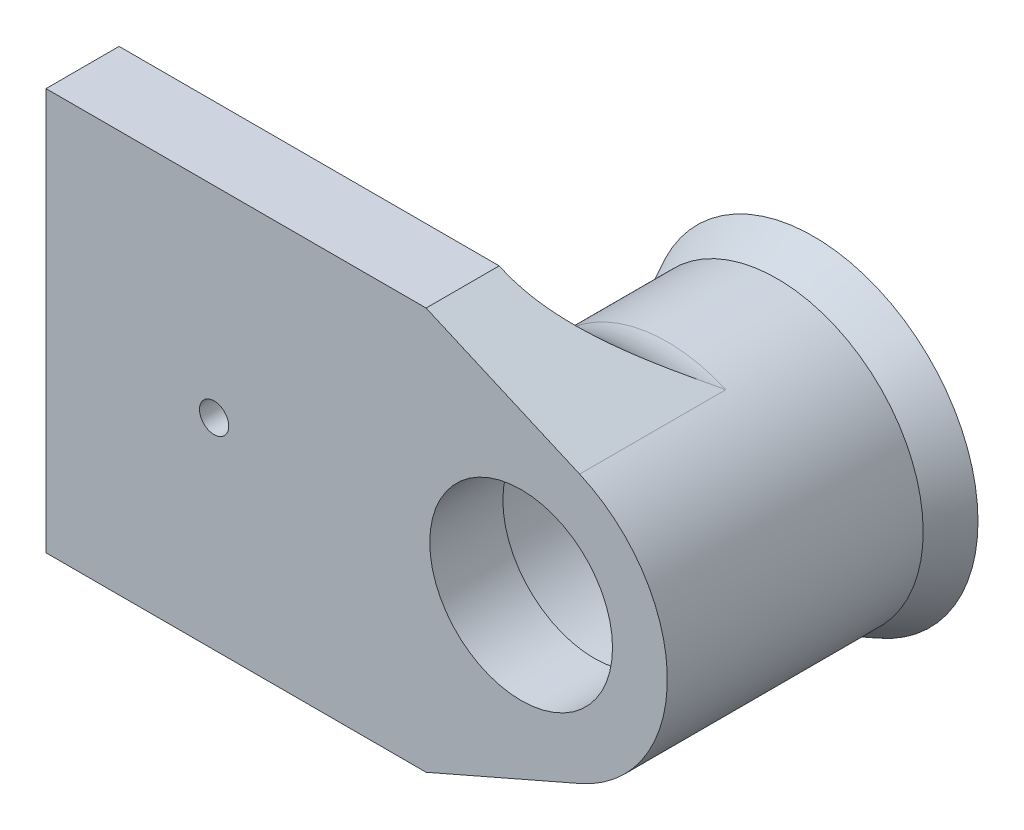
ISO-10303-21;
HEADER;
FILE_DESCRIPTION(('STEP AP214'),'2;1');
FILE_NAME('part.step','',(''),(''),'','','');
FILE_SCHEMA(('AUTOMOTIVE_DESIGN { 1 0 10303 214 1 1 1 1 }'));
ENDSEC;
DATA;
#1=APPLICATION_CONTEXT('core data for automotive mechanical design processes');
#2=APPLICATION_PROTOCOL_DEFINITION('international standard','automotive_design',2000,#1);
#3=PRODUCT_CONTEXT('',#1,'mechanical');
#4=PRODUCT('Part','Part','',(#3));
#5=PRODUCT_RELATED_PRODUCT_CATEGORY('part','',(#4));
#6=PRODUCT_DEFINITION_FORMATION('','',#4);
#7=PRODUCT_DEFINITION_CONTEXT('part definition',#1,'design');
#8=PRODUCT_DEFINITION('design','',#6,#7);
#9=PRODUCT_DEFINITION_SHAPE('','',#8);
#10=(LENGTH_UNIT() NAMED_UNIT(*) SI_UNIT(.MILLI.,.METRE.));
#11=(NAMED_UNIT(*) PLANE_ANGLE_UNIT() SI_UNIT($,.RADIAN.));
#12=(NAMED_UNIT(*) SI_UNIT($,.STERADIAN.) SOLID_ANGLE_UNIT());
#13=UNCERTAINTY_MEASURE_WITH_UNIT(LENGTH_MEASURE(1.E-05),#10,'distance_accuracy_value','');
#14=(GEOMETRIC_REPRESENTATION_CONTEXT(3) GLOBAL_UNCERTAINTY_ASSIGNED_CONTEXT((#13)) GLOBAL_UNIT_ASSIGNED_CONTEXT((#10,
#11,#12)) REPRESENTATION_CONTEXT('',''));
#15=CARTESIAN_POINT('',(0.,0.,0.));
#16=DIRECTION('',(0.,0.,1.));
#17=DIRECTION('',(1.,0.,0.));
#18=AXIS2_PLACEMENT_3D('',#15,#16,#17);
#19=CARTESIAN_POINT('',(0.,0.,0.));
#20=DIRECTION('',(0.,0.,1.));
#21=DIRECTION('',(1.,0.,0.));
#22=AXIS2_PLACEMENT_3D('',#19,#20,#21);
#23=PLANE('',#22);
#24=CARTESIAN_POINT('',(0.,0.,0.));
#25=DIRECTION('',(0.,0.,1.));
#26=DIRECTION('',(1.,0.,0.));
#27=AXIS2_PLACEMENT_3D('',#24,#25,#26);
#28=CIRCLE('',#27,12.5);
#29=CARTESIAN_POINT('',(12.5,0.,0.));
#30=VERTEX_POINT('',#29);
#31=EDGE_CURVE('E145',#30,#30,#28,.T.);
#32=ORIENTED_EDGE('',*,*,#31,.T.);
#33=EDGE_LOOP('',(#32));
#34=FACE_BOUND('',#33,.T.);
#35=CARTESIAN_POINT('',(0.,0.,0.));
#36=DIRECTION('',(0.,0.,-1.));
#37=DIRECTION('',(-1.,0.,0.));
#38=AXIS2_PLACEMENT_3D('',#35,#36,#37);
#39=CIRCLE('',#38,15.);
#40=CARTESIAN_POINT('',(-15.,0.,0.));
#41=VERTEX_POINT('',#40);
#42=EDGE_CURVE('E211',#41,#41,#39,.T.);
#43=ORIENTED_EDGE('',*,*,#42,.T.);
#44=EDGE_LOOP('',(#43));
#45=FACE_BOUND('',#44,.T.);
#46=ADVANCED_FACE('F34',(#34,#45),#23,.F.);
#47=CARTESIAN_POINT('',(0.,0.,10.));
#48=DIRECTION('',(0.,0.,1.));
#49=DIRECTION('',(1.,0.,0.));
#50=AXIS2_PLACEMENT_3D('',#47,#48,#49);
#51=PLANE('',#50);
#52=CARTESIAN_POINT('',(0.,0.,10.));
#53=DIRECTION('',(0.,0.,1.));
#54=DIRECTION('',(1.,0.,0.));
#55=AXIS2_PLACEMENT_3D('',#52,#53,#54);
#56=CIRCLE('',#55,12.5);
#57=CARTESIAN_POINT('',(12.5,0.,10.));
#58=VERTEX_POINT('',#57);
#59=EDGE_CURVE('E153',#58,#58,#56,.T.);
#60=ORIENTED_EDGE('',*,*,#59,.F.);
#61=EDGE_LOOP('',(#60));
#62=FACE_BOUND('',#61,.T.);
#63=DIRECTION('',(0.,-1.,0.));
#64=VECTOR('',#63,1.);
#65=CARTESIAN_POINT('',(-65.,27.5,10.));
#66=LINE('',#65,#64);
#67=CARTESIAN_POINT('',(-65.,27.5,10.));
#68=VERTEX_POINT('',#67);
#69=CARTESIAN_POINT('',(-65.,-27.5,10.));
#70=VERTEX_POINT('',#69);
#71=EDGE_CURVE('E132',#68,#70,#66,.T.);
#72=ORIENTED_EDGE('',*,*,#71,.T.);
#73=DIRECTION('',(1.,0.,0.));
#74=VECTOR('',#73,1.);
#75=CARTESIAN_POINT('',(-13.,-27.5,10.));
#76=LINE('',#75,#74);
#77=CARTESIAN_POINT('',(-13.,-27.5,10.));
#78=VERTEX_POINT('',#77);
#79=EDGE_CURVE('E101',#70,#78,#76,.T.);
#80=ORIENTED_EDGE('',*,*,#79,.T.);
#81=DIRECTION('',(0.916442402102688,0.400166619832609,0.));
#82=VECTOR('',#81,1.);
#83=CARTESIAN_POINT('',(-13.,-27.5,10.));
#84=LINE('',#83,#82);
#85=CARTESIAN_POINT('',(8.00333239665218,-18.3288480420538,10.));
#86=VERTEX_POINT('',#85);
#87=EDGE_CURVE('E136',#78,#86,#84,.T.);
#88=ORIENTED_EDGE('',*,*,#87,.T.);
#89=CARTESIAN_POINT('',(0.,0.,10.));
#90=DIRECTION('',(0.,0.,1.));
#91=DIRECTION('',(1.,0.,0.));
#92=AXIS2_PLACEMENT_3D('',#89,#90,#91);
#93=CIRCLE('',#92,20.);
#94=CARTESIAN_POINT('',(8.00333239665218,18.3288480420538,10.));
#95=VERTEX_POINT('',#94);
#96=EDGE_CURVE('E139',#86,#95,#93,.T.);
#97=ORIENTED_EDGE('',*,*,#96,.T.);
#98=DIRECTION('',(-0.916442402102688,0.400166619832609,0.));
#99=VECTOR('',#98,1.);
#100=CARTESIAN_POINT('',(-13.,27.5,10.));
#101=LINE('',#100,#99);
#102=CARTESIAN_POINT('',(-13.,27.5,10.));
#103=VERTEX_POINT('',#102);
#104=EDGE_CURVE('E122',#95,#103,#101,.T.);
#105=ORIENTED_EDGE('',*,*,#104,.T.);
#106=DIRECTION('',(-1.,0.,0.));
#107=VECTOR('',#106,1.);
#108=CARTESIAN_POINT('',(-13.,27.5,10.));
#109=LINE('',#108,#107);
#110=EDGE_CURVE('E119',#103,#68,#109,.T.);
#111=ORIENTED_EDGE('',*,*,#110,.T.);
#112=EDGE_LOOP('',(#72,#80,#88,#97,#105,#111));
#113=FACE_BOUND('',#112,.T.);
#114=CARTESIAN_POINT('',(-42.,0.,10.));
#115=DIRECTION('',(0.,0.,1.));
#116=DIRECTION('',(1.,0.,0.));
#117=AXIS2_PLACEMENT_3D('',#114,#115,#116);
#118=CIRCLE('',#117,2.);
#119=CARTESIAN_POINT('',(-40.,0.,10.));
#120=VERTEX_POINT('',#119);
#121=EDGE_CURVE('E125',#120,#120,#118,.T.);
#122=ORIENTED_EDGE('',*,*,#121,.F.);
#123=EDGE_LOOP('',(#122));
#124=FACE_BOUND('',#123,.T.);
#125=ADVANCED_FACE('F197',(#62,#113,#124),#51,.T.);
#126=DIRECTION('',(-0.916442402102688,0.400166619832609,0.));
#127=VECTOR('',#126,1.);
#128=CARTESIAN_POINT('',(-13.,27.5,0.));
#129=LINE('',#128,#127);
#130=CARTESIAN_POINT('',(-12.4889426889959,27.276845684774,0.));
#131=VERTEX_POINT('',#130);
#132=CARTESIAN_POINT('',(-13.,27.5,0.));
#133=VERTEX_POINT('',#132);
#134=EDGE_CURVE('E129',#131,#133,#129,.T.);
#135=ORIENTED_EDGE('',*,*,#134,.F.);
#136=CARTESIAN_POINT('',(0.,0.,0.));
#137=DIRECTION('',(0.,0.,1.));
#138=DIRECTION('',(1.,0.,0.));
#139=AXIS2_PLACEMENT_3D('',#136,#137,#138);
#140=CIRCLE('',#139,30.);
#141=CARTESIAN_POINT('',(-12.4889426889959,-27.276845684774,0.));
#142=VERTEX_POINT('',#141);
#143=EDGE_CURVE('E58',#131,#142,#140,.T.);
#144=ORIENTED_EDGE('',*,*,#143,.T.);
#145=DIRECTION('',(0.916442402102688,0.400166619832609,0.));
#146=VECTOR('',#145,1.);
#147=CARTESIAN_POINT('',(-13.,-27.5,0.));
#148=LINE('',#147,#146);
#149=CARTESIAN_POINT('',(-13.,-27.5,0.));
#150=VERTEX_POINT('',#149);
#151=EDGE_CURVE('E115',#150,#142,#148,.T.);
#152=ORIENTED_EDGE('',*,*,#151,.F.);
#153=DIRECTION('',(1.,0.,0.));
#154=VECTOR('',#153,1.);
#155=CARTESIAN_POINT('',(-13.,-27.5,0.));
#156=LINE('',#155,#154);
#157=CARTESIAN_POINT('',(-65.,-27.5,0.));
#158=VERTEX_POINT('',#157);
#159=EDGE_CURVE('E99',#158,#150,#156,.T.);
#160=ORIENTED_EDGE('',*,*,#159,.F.);
#161=DIRECTION('',(0.,-1.,0.));
#162=VECTOR('',#161,1.);
#163=CARTESIAN_POINT('',(-65.,27.5,0.));
#164=LINE('',#163,#162);
#165=CARTESIAN_POINT('',(-65.,27.5,0.));
#166=VERTEX_POINT('',#165);
#167=EDGE_CURVE('E113',#166,#158,#164,.T.);
#168=ORIENTED_EDGE('',*,*,#167,.F.);
#169=DIRECTION('',(-1.,0.,0.));
#170=VECTOR('',#169,1.);
#171=CARTESIAN_POINT('',(-13.,27.5,0.));
#172=LINE('',#171,#170);
#173=EDGE_CURVE('E107',#133,#166,#172,.T.);
#174=ORIENTED_EDGE('',*,*,#173,.F.);
#175=EDGE_LOOP('',(#135,#144,#152,#160,#168,#174));
#176=FACE_BOUND('',#175,.T.);
#177=CARTESIAN_POINT('',(-42.,0.,0.));
#178=DIRECTION('',(0.,0.,1.));
#179=DIRECTION('',(1.,0.,0.));
#180=AXIS2_PLACEMENT_3D('',#177,#178,#179);
#181=CIRCLE('',#180,2.);
#182=CARTESIAN_POINT('',(-40.,0.,0.));
#183=VERTEX_POINT('',#182);
#184=EDGE_CURVE('E134',#183,#183,#181,.T.);
#185=ORIENTED_EDGE('',*,*,#184,.T.);
#186=EDGE_LOOP('',(#185));
#187=FACE_BOUND('',#186,.T.);
#188=ADVANCED_FACE('F110',(#176,#187),#23,.F.);
#189=CARTESIAN_POINT('',(0.,0.,10.));
#190=DIRECTION('',(0.,0.,-1.));
#191=DIRECTION('',(-1.,0.,0.));
#192=AXIS2_PLACEMENT_3D('',#189,#190,#191);
#193=CYLINDRICAL_SURFACE('',#192,12.5);
#194=ORIENTED_EDGE('',*,*,#59,.T.);
#195=EDGE_LOOP('',(#194));
#196=FACE_BOUND('',#195,.T.);
#197=ORIENTED_EDGE('',*,*,#31,.F.);
#198=EDGE_LOOP('',(#197));
#199=FACE_BOUND('',#198,.T.);
#200=ADVANCED_FACE('F193',(#196,#199),#193,.F.);
#201=CARTESIAN_POINT('',(-65.,27.5,0.));
#202=DIRECTION('',(-1.,0.,0.));
#203=DIRECTION('',(0.,-1.,0.));
#204=AXIS2_PLACEMENT_3D('',#201,#202,#203);
#205=PLANE('',#204);
#206=ORIENTED_EDGE('',*,*,#71,.F.);
#207=DIRECTION('',(0.,0.,1.));
#208=VECTOR('',#207,1.);
#209=CARTESIAN_POINT('',(-65.,27.5,0.));
#210=LINE('',#209,#208);
#211=EDGE_CURVE('E118',#166,#68,#210,.T.);
#212=ORIENTED_EDGE('',*,*,#211,.F.);
#213=ORIENTED_EDGE('',*,*,#167,.T.);
#214=DIRECTION('',(0.,0.,1.));
#215=VECTOR('',#214,1.);
#216=CARTESIAN_POINT('',(-65.,-27.5,0.));
#217=LINE('',#216,#215);
#218=EDGE_CURVE('E96',#158,#70,#217,.T.);
#219=ORIENTED_EDGE('',*,*,#218,.T.);
#220=EDGE_LOOP('',(#206,#212,#213,#219));
#221=FACE_BOUND('',#220,.T.);
#222=ADVANCED_FACE('F117',(#221),#205,.T.);
#223=CARTESIAN_POINT('',(-13.,27.5,0.));
#224=DIRECTION('',(0.,1.,0.));
#225=DIRECTION('',(-1.,0.,0.));
#226=AXIS2_PLACEMENT_3D('',#223,#224,#225);
#227=PLANE('',#226);
#228=ORIENTED_EDGE('',*,*,#110,.F.);
#229=DIRECTION('',(0.,0.,1.));
#230=VECTOR('',#229,1.);
#231=CARTESIAN_POINT('',(-13.,27.5,0.));
#232=LINE('',#231,#230);
#233=EDGE_CURVE('E146',#133,#103,#232,.T.);
#234=ORIENTED_EDGE('',*,*,#233,.F.);
#235=ORIENTED_EDGE('',*,*,#173,.T.);
#236=ORIENTED_EDGE('',*,*,#211,.T.);
#237=EDGE_LOOP('',(#228,#234,#235,#236));
#238=FACE_BOUND('',#237,.T.);
#239=ADVANCED_FACE('F179',(#238),#227,.T.);
#240=CARTESIAN_POINT('',(-13.,27.5,0.));
#241=DIRECTION('',(0.400166619832609,0.916442402102688,0.));
#242=DIRECTION('',(-0.916442402102688,0.400166619832609,0.));
#243=AXIS2_PLACEMENT_3D('',#240,#241,#242);
#244=PLANE('',#243);
#245=ORIENTED_EDGE('',*,*,#104,.F.);
#246=DIRECTION('',(0.,0.,1.));
#247=VECTOR('',#246,1.);
#248=CARTESIAN_POINT('',(8.00333239665218,18.3288480420538,0.));
#249=LINE('',#248,#247);
#250=CARTESIAN_POINT('',(8.00333239665218,18.3288480420538,-10.));
#251=VERTEX_POINT('',#250);
#252=EDGE_CURVE('E148',#251,#95,#249,.T.);
#253=ORIENTED_EDGE('',*,*,#252,.F.);
#254=CARTESIAN_POINT('',(-12.4889426889959,27.276845684774,0.));
#255=CARTESIAN_POINT('',(-11.9446877341966,27.0391955443075,-3.26330413884413E-05));
#256=CARTESIAN_POINT('',(-11.4009658007099,26.8017781487865,-0.0293719903271018));
#257=CARTESIAN_POINT('',(-10.3190514183103,26.3293578195222,-0.140443207630718));
#258=CARTESIAN_POINT('',(-9.78085010249353,26.0943510140255,-0.222070433942941));
#259=CARTESIAN_POINT('',(-8.72103298293498,25.6315795038887,-0.429822205031779));
#260=CARTESIAN_POINT('',(-8.19928998965758,25.403759261654,-0.555192532645066));
#261=CARTESIAN_POINT('',(-7.16490702594321,24.9520936324205,-0.845283013004483));
#262=CARTESIAN_POINT('',(-6.65227232148572,24.7282505448233,-1.01002518122993));
#263=CARTESIAN_POINT('',(-5.0340801193754,24.0216633089291,-1.58998860297864));
#264=CARTESIAN_POINT('',(-3.94783443576172,23.5473517073248,-2.0702259975438));
#265=CARTESIAN_POINT('',(-2.35695409733697,22.8526902576527,-2.87830371516685));
#266=CARTESIAN_POINT('',(-1.83262705278875,22.6237416836646,-3.16257464352071));
#267=CARTESIAN_POINT('',(-0.795669896103483,22.1709520273262,-3.75554576306418));
#268=CARTESIAN_POINT('',(-0.283038683363703,21.9471104643954,-4.0642436433082));
#269=CARTESIAN_POINT('',(1.24812842479014,21.2785229299655,-5.0256061049934));
#270=CARTESIAN_POINT('',(2.25056544846398,20.840806566735,-5.70859299262033));
#271=CARTESIAN_POINT('',(4.22621060103694,19.9781367023989,-7.12093445123687));
#272=CARTESIAN_POINT('',(5.19943169360704,19.5531775406775,-7.85026799580421));
#273=CARTESIAN_POINT('',(6.77352196187045,18.8658475126067,-9.05116936694297));
#274=CARTESIAN_POINT('',(7.37785717246115,18.6019631943854,-9.51739782600086));
#275=CARTESIAN_POINT('',(7.98922284263654,18.3350090102988,-9.98911337839222));
#276=CARTESIAN_POINT('',(7.99627761953532,18.3319285262239,-9.99455668892817));
#277=CARTESIAN_POINT('',(8.00333239665217,18.3288480420538,-10.));
#278=B_SPLINE_CURVE_WITH_KNOTS('',3,(#254,#255,#256,#257,#258,#259,#260,#261,#262,#263,#264,
#265,#266,#267,#268,#269,#270,#271,#272,#273,#274,#275,#276,#277),.UNSPECIFIED.,.F.,.F.,(4,2,2,
2,2,2,2,2,2,2,2,4),(0.,1.78007201554378,3.55659299449943,5.30388464058352,7.0521556119378,
10.8779322078759,12.7942256891163,14.710338093017,18.5765462026303,22.4410126539083,
24.8638369819083,24.8921212531558),.UNSPECIFIED.);
#279=EDGE_CURVE('E44',#251,#131,#278,.F.);
#280=ORIENTED_EDGE('',*,*,#279,.T.);
#281=ORIENTED_EDGE('',*,*,#134,.T.);
#282=ORIENTED_EDGE('',*,*,#233,.T.);
#283=EDGE_LOOP('',(#245,#253,#280,#281,#282));
#284=FACE_BOUND('',#283,.T.);
#285=ADVANCED_FACE('F173',(#284),#244,.T.);
#286=CARTESIAN_POINT('',(0.,0.,0.));
#287=DIRECTION('',(0.,0.,1.));
#288=DIRECTION('',(1.,0.,0.));
#289=AXIS2_PLACEMENT_3D('',#286,#287,#288);
#290=CYLINDRICAL_SURFACE('',#289,20.);
#291=CARTESIAN_POINT('',(0.,0.,-10.));
#292=DIRECTION('',(0.,0.,1.));
#293=DIRECTION('',(1.,0.,0.));
#294=AXIS2_PLACEMENT_3D('',#291,#292,#293);
#295=CIRCLE('',#294,20.);
#296=CARTESIAN_POINT('',(8.00333239665218,-18.3288480420538,-10.));
#297=VERTEX_POINT('',#296);
#298=EDGE_CURVE('E156',#297,#251,#295,.F.);
#299=ORIENTED_EDGE('',*,*,#298,.T.);
#300=ORIENTED_EDGE('',*,*,#252,.T.);
#301=ORIENTED_EDGE('',*,*,#96,.F.);
#302=DIRECTION('',(0.,0.,1.));
#303=VECTOR('',#302,1.);
#304=CARTESIAN_POINT('',(8.00333239665218,-18.3288480420538,0.));
#305=LINE('',#304,#303);
#306=EDGE_CURVE('E150',#297,#86,#305,.T.);
#307=ORIENTED_EDGE('',*,*,#306,.F.);
#308=EDGE_LOOP('',(#299,#300,#301,#307));
#309=FACE_BOUND('',#308,.T.);
#310=CARTESIAN_POINT('',(0.,0.,-25.));
#311=DIRECTION('',(0.,0.,-1.));
#312=DIRECTION('',(-1.,0.,0.));
#313=AXIS2_PLACEMENT_3D('',#310,#311,#312);
#314=CIRCLE('',#313,20.);
#315=CARTESIAN_POINT('',(-20.,0.,-25.));
#316=VERTEX_POINT('',#315);
#317=EDGE_CURVE('E213',#316,#316,#314,.T.);
#318=ORIENTED_EDGE('',*,*,#317,.F.);
#319=EDGE_LOOP('',(#318));
#320=FACE_BOUND('',#319,.T.);
#321=ADVANCED_FACE('F178',(#309,#320),#290,.T.);
#322=CARTESIAN_POINT('',(-13.,-27.5,0.));
#323=DIRECTION('',(0.400166619832609,-0.916442402102688,0.));
#324=DIRECTION('',(0.916442402102688,0.400166619832609,0.));
#325=AXIS2_PLACEMENT_3D('',#322,#323,#324);
#326=PLANE('',#325);
#327=ORIENTED_EDGE('',*,*,#87,.F.);
#328=DIRECTION('',(0.,0.,1.));
#329=VECTOR('',#328,1.);
#330=CARTESIAN_POINT('',(-13.,-27.5,0.));
#331=LINE('',#330,#329);
#332=EDGE_CURVE('E106',#150,#78,#331,.T.);
#333=ORIENTED_EDGE('',*,*,#332,.F.);
#334=ORIENTED_EDGE('',*,*,#151,.T.);
#335=CARTESIAN_POINT('',(-12.4889426889959,-27.276845684774,0.));
#336=CARTESIAN_POINT('',(-11.9446877341945,-27.0391955443066,-3.26330413886618E-05));
#337=CARTESIAN_POINT('',(-11.4009658007058,-26.8017781487847,-0.0293719903273203));
#338=CARTESIAN_POINT('',(-10.3190514183027,-26.3293578195189,-0.140443207631702));
#339=CARTESIAN_POINT('',(-9.78085010248425,-26.0943510140215,-0.222070433944435));
#340=CARTESIAN_POINT('',(-8.72103298292612,-25.6315795038848,-0.429822205033833));
#341=CARTESIAN_POINT('',(-8.19928998965068,-25.403759261651,-0.555192532646868));
#342=CARTESIAN_POINT('',(-7.16490702593992,-24.9520936324191,-0.845283013005533));
#343=CARTESIAN_POINT('',(-6.65227232148408,-24.7282505448226,-1.0100251812305));
#344=CARTESIAN_POINT('',(-5.03408011937625,-24.0216633089295,-1.58998860297837));
#345=CARTESIAN_POINT('',(-3.94783443576346,-23.5473517073255,-2.07022599754321));
#346=CARTESIAN_POINT('',(-2.35695409734033,-22.8526902576542,-2.87830371516499));
#347=CARTESIAN_POINT('',(-1.83262705279298,-22.6237416836664,-3.1625746435181));
#348=CARTESIAN_POINT('',(-0.795669896109767,-22.170952027329,-3.75554576306076));
#349=CARTESIAN_POINT('',(-0.283038683371172,-21.9471104643986,-4.06424364330471));
#350=CARTESIAN_POINT('',(1.24812842478436,-21.2785229299681,-5.02560610498732));
#351=CARTESIAN_POINT('',(2.25056544846363,-20.8408065667352,-5.70859299260783));
#352=CARTESIAN_POINT('',(4.22621060102831,-19.9781367024027,-7.12093445124292));
#353=CARTESIAN_POINT('',(5.19943169358468,-19.5531775406872,-7.85026799583523));
#354=CARTESIAN_POINT('',(6.77352196188367,-18.865847512601,-9.05116936692286));
#355=CARTESIAN_POINT('',(7.37785717250167,-18.6019631943679,-9.51739782593855));
#356=CARTESIAN_POINT('',(7.98922284263748,-18.3350090102984,-9.98911337839078));
#357=CARTESIAN_POINT('',(7.99627761953579,-18.3319285262237,-9.99455668892744));
#358=CARTESIAN_POINT('',(8.00333239665218,-18.3288480420538,-10.));
#359=B_SPLINE_CURVE_WITH_KNOTS('',3,(#335,#336,#337,#338,#339,#340,#341,#342,#343,#344,#345,
#346,#347,#348,#349,#350,#351,#352,#353,#354,#355,#356,#357,#358),.UNSPECIFIED.,.F.,.F.,(4,2,2,
2,2,2,2,2,2,2,2,4),(0.,1.78007201555042,3.55659299451142,5.30388464058909,7.05215561193781,
10.877932207873,12.7942256891098,14.7103380930072,18.5765462026239,22.4410126539086,
24.8638369819083,24.8921212531558),.UNSPECIFIED.);
#360=EDGE_CURVE('E12',#142,#297,#359,.T.);
#361=ORIENTED_EDGE('',*,*,#360,.T.);
#362=ORIENTED_EDGE('',*,*,#306,.T.);
#363=EDGE_LOOP('',(#327,#333,#334,#361,#362));
#364=FACE_BOUND('',#363,.T.);
#365=ADVANCED_FACE('F182',(#364),#326,.T.);
#366=CARTESIAN_POINT('',(-13.,-27.5,0.));
#367=DIRECTION('',(0.,-1.,0.));
#368=DIRECTION('',(1.,0.,0.));
#369=AXIS2_PLACEMENT_3D('',#366,#367,#368);
#370=PLANE('',#369);
#371=ORIENTED_EDGE('',*,*,#79,.F.);
#372=ORIENTED_EDGE('',*,*,#218,.F.);
#373=ORIENTED_EDGE('',*,*,#159,.T.);
#374=ORIENTED_EDGE('',*,*,#332,.T.);
#375=EDGE_LOOP('',(#371,#372,#373,#374));
#376=FACE_BOUND('',#375,.T.);
#377=ADVANCED_FACE('F98',(#376),#370,.T.);
#378=CARTESIAN_POINT('',(-42.,0.,0.));
#379=DIRECTION('',(0.,0.,1.));
#380=DIRECTION('',(1.,0.,0.));
#381=AXIS2_PLACEMENT_3D('',#378,#379,#380);
#382=CYLINDRICAL_SURFACE('',#381,2.);
#383=ORIENTED_EDGE('',*,*,#184,.F.);
#384=EDGE_LOOP('',(#383));
#385=FACE_BOUND('',#384,.T.);
#386=ORIENTED_EDGE('',*,*,#121,.T.);
#387=EDGE_LOOP('',(#386));
#388=FACE_BOUND('',#387,.T.);
#389=ADVANCED_FACE('F190',(#385,#388),#382,.F.);
#390=CARTESIAN_POINT('',(0.,0.,-25.));
#391=DIRECTION('',(0.,0.,1.));
#392=DIRECTION('',(1.,0.,0.));
#393=AXIS2_PLACEMENT_3D('',#390,#391,#392);
#394=CYLINDRICAL_SURFACE('',#393,15.);
#395=ORIENTED_EDGE('',*,*,#42,.F.);
#396=EDGE_LOOP('',(#395));
#397=FACE_BOUND('',#396,.T.);
#398=CARTESIAN_POINT('',(0.,0.,-30.));
#399=DIRECTION('',(0.,0.,-1.));
#400=DIRECTION('',(-1.,0.,0.));
#401=AXIS2_PLACEMENT_3D('',#398,#399,#400);
#402=CIRCLE('',#401,15.);
#403=CARTESIAN_POINT('',(-15.,0.,-30.));
#404=VERTEX_POINT('',#403);
#405=EDGE_CURVE('E39',#404,#404,#402,.T.);
#406=ORIENTED_EDGE('',*,*,#405,.T.);
#407=EDGE_LOOP('',(#406));
#408=FACE_BOUND('',#407,.T.);
#409=ADVANCED_FACE('F228',(#397,#408),#394,.F.);
#410=CARTESIAN_POINT('',(0.,0.,-10.));
#411=DIRECTION('',(0.,0.,1.));
#412=DIRECTION('',(1.,0.,0.));
#413=AXIS2_PLACEMENT_3D('',#410,#411,#412);
#414=TOROIDAL_SURFACE('',#413,30.,10.);
#415=ORIENTED_EDGE('',*,*,#360,.F.);
#416=ORIENTED_EDGE('',*,*,#143,.F.);
#417=ORIENTED_EDGE('',*,*,#279,.F.);
#418=ORIENTED_EDGE('',*,*,#298,.F.);
#419=EDGE_LOOP('',(#415,#416,#417,#418));
#420=FACE_BOUND('',#419,.T.);
#421=ADVANCED_FACE('F36',(#420),#414,.F.);
#422=CARTESIAN_POINT('',(0.,0.,-30.));
#423=DIRECTION('',(0.,0.,-1.));
#424=DIRECTION('',(-1.,0.,0.));
#425=AXIS2_PLACEMENT_3D('',#422,#423,#424);
#426=PLANE('',#425);
#427=ORIENTED_EDGE('',*,*,#405,.F.);
#428=EDGE_LOOP('',(#427));
#429=FACE_BOUND('',#428,.T.);
#430=CARTESIAN_POINT('',(0.,0.,-30.));
#431=DIRECTION('',(0.,0.,-1.));
#432=DIRECTION('',(-1.,0.,0.));
#433=AXIS2_PLACEMENT_3D('',#430,#431,#432);
#434=CIRCLE('',#433,22.5);
#435=CARTESIAN_POINT('',(-22.5,0.,-30.));
#436=VERTEX_POINT('',#435);
#437=EDGE_CURVE('E214',#436,#436,#434,.T.);
#438=ORIENTED_EDGE('',*,*,#437,.T.);
#439=EDGE_LOOP('',(#438));
#440=FACE_BOUND('',#439,.T.);
#441=ADVANCED_FACE('F239',(#429,#440),#426,.T.);
#442=CARTESIAN_POINT('',(0.,0.,-25.));
#443=DIRECTION('',(0.,0.,-1.));
#444=DIRECTION('',(-1.,0.,0.));
#445=AXIS2_PLACEMENT_3D('',#442,#443,#444);
#446=CONICAL_SURFACE('',#445,20.,0.463647609000805);
#447=ORIENTED_EDGE('',*,*,#437,.F.);
#448=EDGE_LOOP('',(#447));
#449=FACE_BOUND('',#448,.T.);
#450=ORIENTED_EDGE('',*,*,#317,.T.);
#451=EDGE_LOOP('',(#450));
#452=FACE_BOUND('',#451,.T.);
#453=ADVANCED_FACE('F235',(#449,#452),#446,.T.);
#454=CLOSED_SHELL('',(#46,#125,#188,#200,#222,#239,#285,#321,#365,#377,#389,#409,#421,#441,#453));
#455=MANIFOLD_SOLID_BREP('B2',#454);
#456=ADVANCED_BREP_SHAPE_REPRESENTATION('',(#18,#455),#14);
#457=SHAPE_DEFINITION_REPRESENTATION(#9,#456);
ENDSEC;
END-ISO-10303-21;
